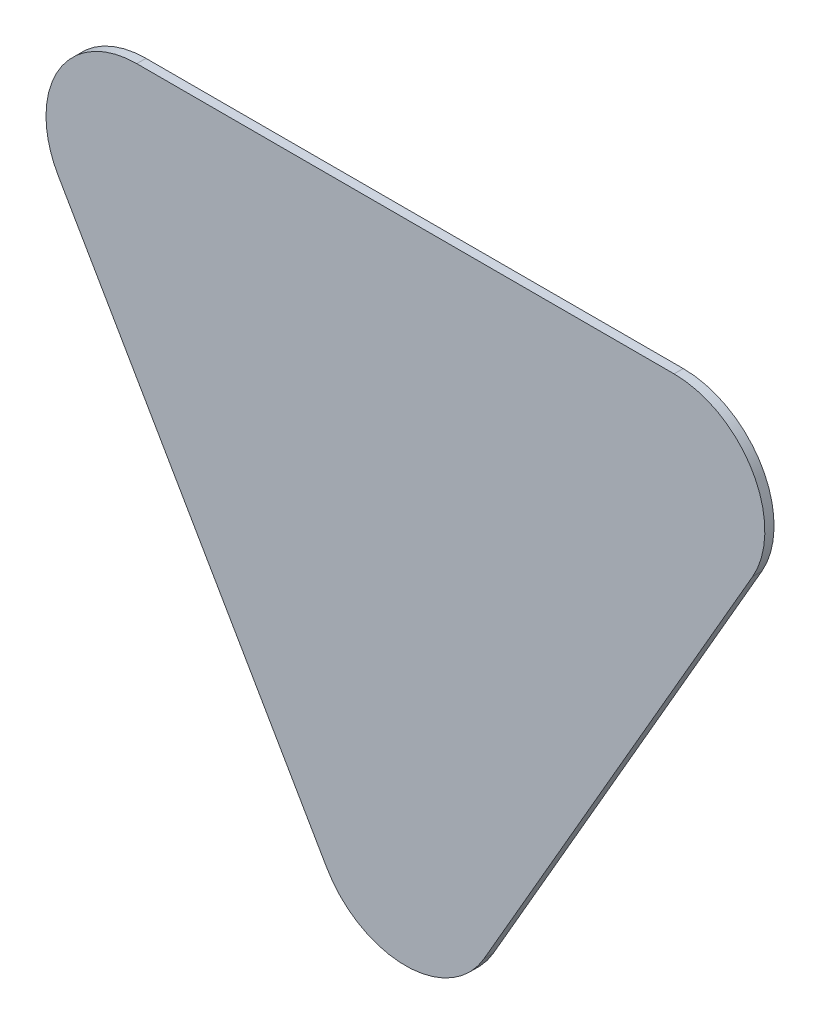
ISO-10303-21;
HEADER;
FILE_DESCRIPTION(('STEP AP214'),'2;1');
FILE_NAME('part.step','',(''),(''),'','','');
FILE_SCHEMA(('AUTOMOTIVE_DESIGN { 1 0 10303 214 1 1 1 1 }'));
ENDSEC;
DATA;
#1=APPLICATION_CONTEXT('core data for automotive mechanical design processes');
#2=APPLICATION_PROTOCOL_DEFINITION('international standard','automotive_design',2000,#1);
#3=PRODUCT_CONTEXT('',#1,'mechanical');
#4=PRODUCT('Part','Part','',(#3));
#5=PRODUCT_RELATED_PRODUCT_CATEGORY('part','',(#4));
#6=PRODUCT_DEFINITION_FORMATION('','',#4);
#7=PRODUCT_DEFINITION_CONTEXT('part definition',#1,'design');
#8=PRODUCT_DEFINITION('design','',#6,#7);
#9=PRODUCT_DEFINITION_SHAPE('','',#8);
#10=(LENGTH_UNIT() NAMED_UNIT(*) SI_UNIT(.MILLI.,.METRE.));
#11=(NAMED_UNIT(*) PLANE_ANGLE_UNIT() SI_UNIT($,.RADIAN.));
#12=(NAMED_UNIT(*) SI_UNIT($,.STERADIAN.) SOLID_ANGLE_UNIT());
#13=UNCERTAINTY_MEASURE_WITH_UNIT(LENGTH_MEASURE(1.E-05),#10,'distance_accuracy_value','');
#14=(GEOMETRIC_REPRESENTATION_CONTEXT(3) GLOBAL_UNCERTAINTY_ASSIGNED_CONTEXT((#13)) GLOBAL_UNIT_ASSIGNED_CONTEXT((#10,
#11,#12)) REPRESENTATION_CONTEXT('',''));
#15=CARTESIAN_POINT('',(0.,0.,0.));
#16=DIRECTION('',(0.,0.,1.));
#17=DIRECTION('',(1.,0.,0.));
#18=AXIS2_PLACEMENT_3D('',#15,#16,#17);
#19=CARTESIAN_POINT('',(0.,0.,0.));
#20=DIRECTION('',(0.,0.,1.));
#21=DIRECTION('',(1.,0.,0.));
#22=AXIS2_PLACEMENT_3D('',#19,#20,#21);
#23=PLANE('',#22);
#24=CARTESIAN_POINT('',(116.883451266307,281.448076157246,0.));
#25=DIRECTION('',(0.,0.,-1.));
#26=DIRECTION('',(-1.,0.,0.));
#27=AXIS2_PLACEMENT_3D('',#24,#25,#26);
#28=CIRCLE('',#27,39.5);
#29=CARTESIAN_POINT('',(151.091454715793,261.698076157246,0.));
#30=VERTEX_POINT('',#29);
#31=CARTESIAN_POINT('',(116.883451266307,320.948076157246,0.));
#32=VERTEX_POINT('',#31);
#33=EDGE_CURVE('E20',#30,#32,#28,.F.);
#34=ORIENTED_EDGE('',*,*,#33,.F.);
#35=DIRECTION('',(-0.499999999999999,-0.866025403784439,0.));
#36=VECTOR('',#35,1.);
#37=CARTESIAN_POINT('',(185.299458165278,320.948076157246,0.));
#38=LINE('',#37,#36);
#39=CARTESIAN_POINT('',(34.2080034494854,59.2500000000002,0.));
#40=VERTEX_POINT('',#39);
#41=EDGE_CURVE('E72',#30,#40,#38,.T.);
#42=ORIENTED_EDGE('',*,*,#41,.T.);
#43=CARTESIAN_POINT('',(0.,79.0000000000002,0.));
#44=DIRECTION('',(0.,0.,-1.));
#45=DIRECTION('',(-1.,0.,0.));
#46=AXIS2_PLACEMENT_3D('',#43,#44,#45);
#47=CIRCLE('',#46,39.5);
#48=CARTESIAN_POINT('',(-34.2080034494854,59.2500000000002,0.));
#49=VERTEX_POINT('',#48);
#50=EDGE_CURVE('E116',#49,#40,#47,.F.);
#51=ORIENTED_EDGE('',*,*,#50,.F.);
#52=DIRECTION('',(-0.5,0.866025403784439,0.));
#53=VECTOR('',#52,1.);
#54=CARTESIAN_POINT('',(-185.299458165278,320.948076157246,0.));
#55=LINE('',#54,#53);
#56=CARTESIAN_POINT('',(-151.091454715793,261.698076157246,0.));
#57=VERTEX_POINT('',#56);
#58=EDGE_CURVE('E103',#49,#57,#55,.T.);
#59=ORIENTED_EDGE('',*,*,#58,.T.);
#60=CARTESIAN_POINT('',(-116.883451266308,281.448076157246,0.));
#61=DIRECTION('',(0.,0.,-1.));
#62=DIRECTION('',(-1.,0.,0.));
#63=AXIS2_PLACEMENT_3D('',#60,#61,#62);
#64=CIRCLE('',#63,39.5);
#65=CARTESIAN_POINT('',(-156.383451266308,281.448076157246,0.));
#66=VERTEX_POINT('',#65);
#67=EDGE_CURVE('E105',#66,#57,#64,.F.);
#68=ORIENTED_EDGE('',*,*,#67,.F.);
#69=CARTESIAN_POINT('',(-116.883451266308,281.448076157246,0.));
#70=DIRECTION('',(0.,0.,-1.));
#71=DIRECTION('',(-1.,0.,0.));
#72=AXIS2_PLACEMENT_3D('',#69,#70,#71);
#73=CIRCLE('',#72,39.5);
#74=CARTESIAN_POINT('',(-116.883451266308,320.948076157246,0.));
#75=VERTEX_POINT('',#74);
#76=EDGE_CURVE('E81',#75,#66,#73,.F.);
#77=ORIENTED_EDGE('',*,*,#76,.F.);
#78=DIRECTION('',(1.,0.,0.));
#79=VECTOR('',#78,1.);
#80=CARTESIAN_POINT('',(185.299458165278,320.948076157246,0.));
#81=LINE('',#80,#79);
#82=EDGE_CURVE('E77',#75,#32,#81,.T.);
#83=ORIENTED_EDGE('',*,*,#82,.T.);
#84=EDGE_LOOP('',(#34,#42,#51,#59,#68,#77,#83));
#85=FACE_BOUND('',#84,.T.);
#86=ADVANCED_FACE('F17',(#85),#23,.F.);
#87=CARTESIAN_POINT('',(185.299458165278,320.948076157246,4.));
#88=DIRECTION('',(-0.866025403784439,0.499999999999999,0.));
#89=DIRECTION('',(-0.499999999999999,-0.866025403784439,0.));
#90=AXIS2_PLACEMENT_3D('',#87,#88,#89);
#91=PLANE('',#90);
#92=DIRECTION('',(0.,0.,-1.));
#93=VECTOR('',#92,1.);
#94=CARTESIAN_POINT('',(151.091454715793,261.698076157246,4.));
#95=LINE('',#94,#93);
#96=CARTESIAN_POINT('',(151.091454715793,261.698076157246,4.));
#97=VERTEX_POINT('',#96);
#98=EDGE_CURVE('E91',#97,#30,#95,.T.);
#99=ORIENTED_EDGE('',*,*,#98,.F.);
#100=DIRECTION('',(0.499999999999999,0.866025403784439,0.));
#101=VECTOR('',#100,1.);
#102=CARTESIAN_POINT('',(34.2080034494854,59.2500000000002,4.));
#103=LINE('',#102,#101);
#104=CARTESIAN_POINT('',(34.2080034494854,59.2500000000002,4.));
#105=VERTEX_POINT('',#104);
#106=EDGE_CURVE('E115',#105,#97,#103,.T.);
#107=ORIENTED_EDGE('',*,*,#106,.F.);
#108=DIRECTION('',(0.,0.,-1.));
#109=VECTOR('',#108,1.);
#110=CARTESIAN_POINT('',(34.2080034494854,59.2500000000003,4.));
#111=LINE('',#110,#109);
#112=EDGE_CURVE('E119',#40,#105,#111,.F.);
#113=ORIENTED_EDGE('',*,*,#112,.F.);
#114=ORIENTED_EDGE('',*,*,#41,.F.);
#115=EDGE_LOOP('',(#99,#107,#113,#114));
#116=FACE_BOUND('',#115,.T.);
#117=ADVANCED_FACE('F143',(#116),#91,.F.);
#118=CARTESIAN_POINT('',(116.883451266307,281.448076157246,4.));
#119=DIRECTION('',(0.,0.,-1.));
#120=DIRECTION('',(-1.,0.,0.));
#121=AXIS2_PLACEMENT_3D('',#118,#119,#120);
#122=CYLINDRICAL_SURFACE('',#121,39.5);
#123=ORIENTED_EDGE('',*,*,#33,.T.);
#124=DIRECTION('',(0.,0.,1.));
#125=VECTOR('',#124,1.);
#126=CARTESIAN_POINT('',(116.883451266307,320.948076157246,4.));
#127=LINE('',#126,#125);
#128=CARTESIAN_POINT('',(116.883451266307,320.948076157246,4.));
#129=VERTEX_POINT('',#128);
#130=EDGE_CURVE('E85',#32,#129,#127,.T.);
#131=ORIENTED_EDGE('',*,*,#130,.T.);
#132=CARTESIAN_POINT('',(116.883451266307,281.448076157246,4.));
#133=DIRECTION('',(0.,0.,-1.));
#134=DIRECTION('',(-1.,0.,0.));
#135=AXIS2_PLACEMENT_3D('',#132,#133,#134);
#136=CIRCLE('',#135,39.5);
#137=EDGE_CURVE('E113',#97,#129,#136,.F.);
#138=ORIENTED_EDGE('',*,*,#137,.F.);
#139=ORIENTED_EDGE('',*,*,#98,.T.);
#140=EDGE_LOOP('',(#123,#131,#138,#139));
#141=FACE_BOUND('',#140,.T.);
#142=ADVANCED_FACE('F88',(#141),#122,.T.);
#143=CARTESIAN_POINT('',(185.299458165278,320.948076157246,4.));
#144=DIRECTION('',(0.,-1.,0.));
#145=DIRECTION('',(1.,0.,0.));
#146=AXIS2_PLACEMENT_3D('',#143,#144,#145);
#147=PLANE('',#146);
#148=ORIENTED_EDGE('',*,*,#130,.F.);
#149=ORIENTED_EDGE('',*,*,#82,.F.);
#150=DIRECTION('',(0.,0.,-1.));
#151=VECTOR('',#150,1.);
#152=CARTESIAN_POINT('',(-116.883451266308,320.948076157246,4.));
#153=LINE('',#152,#151);
#154=CARTESIAN_POINT('',(-116.883451266308,320.948076157246,4.));
#155=VERTEX_POINT('',#154);
#156=EDGE_CURVE('E96',#155,#75,#153,.T.);
#157=ORIENTED_EDGE('',*,*,#156,.F.);
#158=DIRECTION('',(1.,0.,0.));
#159=VECTOR('',#158,1.);
#160=CARTESIAN_POINT('',(0.,320.948076157246,4.));
#161=LINE('',#160,#159);
#162=EDGE_CURVE('E94',#129,#155,#161,.F.);
#163=ORIENTED_EDGE('',*,*,#162,.F.);
#164=EDGE_LOOP('',(#148,#149,#157,#163));
#165=FACE_BOUND('',#164,.T.);
#166=ADVANCED_FACE('F92',(#165),#147,.F.);
#167=CARTESIAN_POINT('',(-116.883451266308,281.448076157246,4.));
#168=DIRECTION('',(0.,0.,-1.));
#169=DIRECTION('',(-1.,0.,0.));
#170=AXIS2_PLACEMENT_3D('',#167,#168,#169);
#171=CYLINDRICAL_SURFACE('',#170,39.5);
#172=ORIENTED_EDGE('',*,*,#156,.T.);
#173=ORIENTED_EDGE('',*,*,#76,.T.);
#174=DIRECTION('',(0.,0.,-1.));
#175=VECTOR('',#174,1.);
#176=CARTESIAN_POINT('',(-156.383451266308,281.448076157246,4.));
#177=LINE('',#176,#175);
#178=CARTESIAN_POINT('',(-156.383451266308,281.448076157246,4.));
#179=VERTEX_POINT('',#178);
#180=EDGE_CURVE('E121',#179,#66,#177,.T.);
#181=ORIENTED_EDGE('',*,*,#180,.F.);
#182=CARTESIAN_POINT('',(-116.883451266308,281.448076157246,4.));
#183=DIRECTION('',(0.,0.,-1.));
#184=DIRECTION('',(-1.,0.,0.));
#185=AXIS2_PLACEMENT_3D('',#182,#183,#184);
#186=CIRCLE('',#185,39.5);
#187=EDGE_CURVE('E110',#155,#179,#186,.F.);
#188=ORIENTED_EDGE('',*,*,#187,.F.);
#189=EDGE_LOOP('',(#172,#173,#181,#188));
#190=FACE_BOUND('',#189,.T.);
#191=ADVANCED_FACE('F145',(#190),#171,.T.);
#192=CARTESIAN_POINT('',(-116.883451266308,281.448076157246,4.));
#193=DIRECTION('',(0.,0.,-1.));
#194=DIRECTION('',(-1.,0.,0.));
#195=AXIS2_PLACEMENT_3D('',#192,#193,#194);
#196=CYLINDRICAL_SURFACE('',#195,39.5);
#197=ORIENTED_EDGE('',*,*,#67,.T.);
#198=DIRECTION('',(0.,0.,1.));
#199=VECTOR('',#198,1.);
#200=CARTESIAN_POINT('',(-151.091454715793,261.698076157246,4.));
#201=LINE('',#200,#199);
#202=CARTESIAN_POINT('',(-151.091454715793,261.698076157246,4.));
#203=VERTEX_POINT('',#202);
#204=EDGE_CURVE('E104',#57,#203,#201,.T.);
#205=ORIENTED_EDGE('',*,*,#204,.T.);
#206=CARTESIAN_POINT('',(-116.883451266308,281.448076157246,4.));
#207=DIRECTION('',(0.,0.,-1.));
#208=DIRECTION('',(-1.,0.,0.));
#209=AXIS2_PLACEMENT_3D('',#206,#207,#208);
#210=CIRCLE('',#209,39.5);
#211=EDGE_CURVE('E107',#179,#203,#210,.F.);
#212=ORIENTED_EDGE('',*,*,#211,.F.);
#213=ORIENTED_EDGE('',*,*,#180,.T.);
#214=EDGE_LOOP('',(#197,#205,#212,#213));
#215=FACE_BOUND('',#214,.T.);
#216=ADVANCED_FACE('F140',(#215),#196,.T.);
#217=CARTESIAN_POINT('',(-185.299458165278,320.948076157246,4.));
#218=DIRECTION('',(0.866025403784439,0.5,0.));
#219=DIRECTION('',(-0.5,0.866025403784439,0.));
#220=AXIS2_PLACEMENT_3D('',#217,#218,#219);
#221=PLANE('',#220);
#222=ORIENTED_EDGE('',*,*,#204,.F.);
#223=ORIENTED_EDGE('',*,*,#58,.F.);
#224=DIRECTION('',(0.,0.,-1.));
#225=VECTOR('',#224,1.);
#226=CARTESIAN_POINT('',(-34.2080034494853,59.2500000000002,4.));
#227=LINE('',#226,#225);
#228=CARTESIAN_POINT('',(-34.2080034494854,59.2500000000002,4.));
#229=VERTEX_POINT('',#228);
#230=EDGE_CURVE('E35',#229,#49,#227,.T.);
#231=ORIENTED_EDGE('',*,*,#230,.F.);
#232=DIRECTION('',(0.5,-0.866025403784439,0.));
#233=VECTOR('',#232,1.);
#234=CARTESIAN_POINT('',(-151.091454715793,261.698076157246,4.));
#235=LINE('',#234,#233);
#236=EDGE_CURVE('E26',#203,#229,#235,.T.);
#237=ORIENTED_EDGE('',*,*,#236,.F.);
#238=EDGE_LOOP('',(#222,#223,#231,#237));
#239=FACE_BOUND('',#238,.T.);
#240=ADVANCED_FACE('F138',(#239),#221,.F.);
#241=CARTESIAN_POINT('',(0.,79.0000000000002,4.));
#242=DIRECTION('',(0.,0.,-1.));
#243=DIRECTION('',(-1.,0.,0.));
#244=AXIS2_PLACEMENT_3D('',#241,#242,#243);
#245=CYLINDRICAL_SURFACE('',#244,39.5);
#246=ORIENTED_EDGE('',*,*,#50,.T.);
#247=ORIENTED_EDGE('',*,*,#112,.T.);
#248=CARTESIAN_POINT('',(0.,79.0000000000002,4.));
#249=DIRECTION('',(0.,0.,-1.));
#250=DIRECTION('',(-1.,0.,0.));
#251=AXIS2_PLACEMENT_3D('',#248,#249,#250);
#252=CIRCLE('',#251,39.5);
#253=EDGE_CURVE('E11',#229,#105,#252,.F.);
#254=ORIENTED_EDGE('',*,*,#253,.F.);
#255=ORIENTED_EDGE('',*,*,#230,.T.);
#256=EDGE_LOOP('',(#246,#247,#254,#255));
#257=FACE_BOUND('',#256,.T.);
#258=ADVANCED_FACE('F142',(#257),#245,.T.);
#259=CARTESIAN_POINT('',(0.,0.,4.));
#260=DIRECTION('',(0.,0.,1.));
#261=DIRECTION('',(1.,0.,0.));
#262=AXIS2_PLACEMENT_3D('',#259,#260,#261);
#263=PLANE('',#262);
#264=ORIENTED_EDGE('',*,*,#236,.T.);
#265=ORIENTED_EDGE('',*,*,#253,.T.);
#266=ORIENTED_EDGE('',*,*,#106,.T.);
#267=ORIENTED_EDGE('',*,*,#137,.T.);
#268=ORIENTED_EDGE('',*,*,#162,.T.);
#269=ORIENTED_EDGE('',*,*,#187,.T.);
#270=ORIENTED_EDGE('',*,*,#211,.T.);
#271=EDGE_LOOP('',(#264,#265,#266,#267,#268,#269,#270));
#272=FACE_BOUND('',#271,.T.);
#273=ADVANCED_FACE('F136',(#272),#263,.T.);
#274=CLOSED_SHELL('',(#86,#117,#142,#166,#191,#216,#240,#258,#273));
#275=MANIFOLD_SOLID_BREP('B1',#274);
#276=ADVANCED_BREP_SHAPE_REPRESENTATION('',(#18,#275),#14);
#277=SHAPE_DEFINITION_REPRESENTATION(#9,#276);
ENDSEC;
END-ISO-10303-21;
